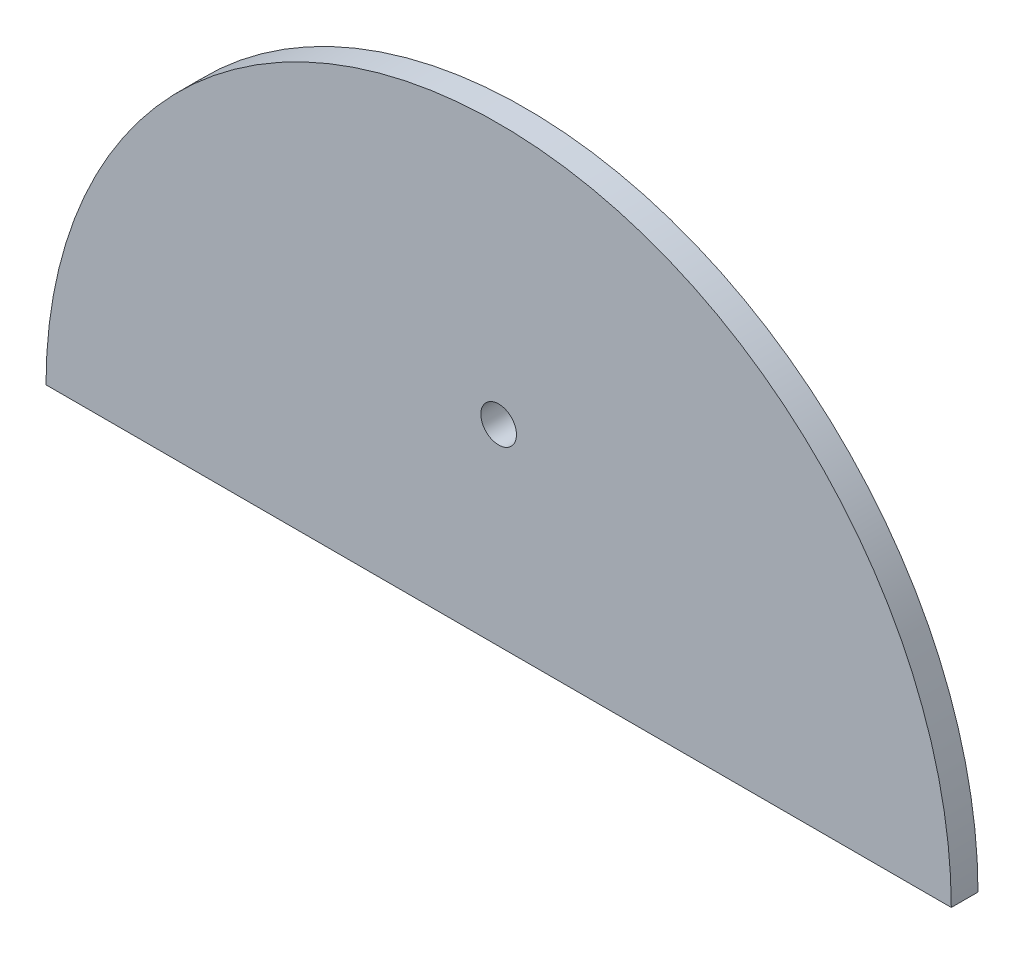
ISO-10303-21;
HEADER;
FILE_DESCRIPTION(('STEP AP214'),'2;1');
FILE_NAME('part.step','',(''),(''),'','','');
FILE_SCHEMA(('AUTOMOTIVE_DESIGN { 1 0 10303 214 1 1 1 1 }'));
ENDSEC;
DATA;
#1=APPLICATION_CONTEXT('core data for automotive mechanical design processes');
#2=APPLICATION_PROTOCOL_DEFINITION('international standard','automotive_design',2000,#1);
#3=PRODUCT_CONTEXT('',#1,'mechanical');
#4=PRODUCT('Part','Part','',(#3));
#5=PRODUCT_RELATED_PRODUCT_CATEGORY('part','',(#4));
#6=PRODUCT_DEFINITION_FORMATION('','',#4);
#7=PRODUCT_DEFINITION_CONTEXT('part definition',#1,'design');
#8=PRODUCT_DEFINITION('design','',#6,#7);
#9=PRODUCT_DEFINITION_SHAPE('','',#8);
#10=(LENGTH_UNIT() NAMED_UNIT(*) SI_UNIT(.MILLI.,.METRE.));
#11=(NAMED_UNIT(*) PLANE_ANGLE_UNIT() SI_UNIT($,.RADIAN.));
#12=(NAMED_UNIT(*) SI_UNIT($,.STERADIAN.) SOLID_ANGLE_UNIT());
#13=UNCERTAINTY_MEASURE_WITH_UNIT(LENGTH_MEASURE(1.E-05),#10,'distance_accuracy_value','');
#14=(GEOMETRIC_REPRESENTATION_CONTEXT(3) GLOBAL_UNCERTAINTY_ASSIGNED_CONTEXT((#13)) GLOBAL_UNIT_ASSIGNED_CONTEXT((#10,
#11,#12)) REPRESENTATION_CONTEXT('',''));
#15=CARTESIAN_POINT('',(0.,0.,0.));
#16=DIRECTION('',(0.,0.,1.));
#17=DIRECTION('',(1.,0.,0.));
#18=AXIS2_PLACEMENT_3D('',#15,#16,#17);
#19=CARTESIAN_POINT('',(0.,0.,3.));
#20=DIRECTION('',(0.,0.,-1.));
#21=DIRECTION('',(-1.,0.,0.));
#22=AXIS2_PLACEMENT_3D('',#19,#20,#21);
#23=CYLINDRICAL_SURFACE('',#22,50.85);
#24=CARTESIAN_POINT('',(0.,0.,0.));
#25=DIRECTION('',(0.,0.,1.));
#26=DIRECTION('',(-1.,0.,0.));
#27=AXIS2_PLACEMENT_3D('',#24,#25,#26);
#28=CIRCLE('',#27,50.85);
#29=CARTESIAN_POINT('',(50.85,0.,0.));
#30=VERTEX_POINT('',#29);
#31=CARTESIAN_POINT('',(-50.85,0.,0.));
#32=VERTEX_POINT('',#31);
#33=EDGE_CURVE('E63',#30,#32,#28,.T.);
#34=ORIENTED_EDGE('',*,*,#33,.T.);
#35=DIRECTION('',(0.,0.,-1.));
#36=VECTOR('',#35,1.);
#37=CARTESIAN_POINT('',(-50.85,0.,3.));
#38=LINE('',#37,#36);
#39=CARTESIAN_POINT('',(-50.85,0.,3.));
#40=VERTEX_POINT('',#39);
#41=EDGE_CURVE('E11',#40,#32,#38,.T.);
#42=ORIENTED_EDGE('',*,*,#41,.F.);
#43=CARTESIAN_POINT('',(0.,0.,3.));
#44=DIRECTION('',(0.,0.,1.));
#45=DIRECTION('',(-1.,0.,0.));
#46=AXIS2_PLACEMENT_3D('',#43,#44,#45);
#47=CIRCLE('',#46,50.85);
#48=CARTESIAN_POINT('',(50.85,0.,3.));
#49=VERTEX_POINT('',#48);
#50=EDGE_CURVE('E62',#49,#40,#47,.T.);
#51=ORIENTED_EDGE('',*,*,#50,.F.);
#52=DIRECTION('',(0.,0.,-1.));
#53=VECTOR('',#52,1.);
#54=CARTESIAN_POINT('',(50.85,0.,3.));
#55=LINE('',#54,#53);
#56=EDGE_CURVE('E40',#49,#30,#55,.T.);
#57=ORIENTED_EDGE('',*,*,#56,.T.);
#58=EDGE_LOOP('',(#34,#42,#51,#57));
#59=FACE_BOUND('',#58,.T.);
#60=ADVANCED_FACE('F32',(#59),#23,.T.);
#61=CARTESIAN_POINT('',(-50.85,0.,3.));
#62=DIRECTION('',(0.,1.,0.));
#63=DIRECTION('',(0.,0.,1.));
#64=AXIS2_PLACEMENT_3D('',#61,#62,#63);
#65=PLANE('',#64);
#66=DIRECTION('',(1.,0.,0.));
#67=VECTOR('',#66,1.);
#68=CARTESIAN_POINT('',(-50.85,0.,0.));
#69=LINE('',#68,#67);
#70=EDGE_CURVE('E55',#32,#30,#69,.T.);
#71=ORIENTED_EDGE('',*,*,#70,.T.);
#72=ORIENTED_EDGE('',*,*,#56,.F.);
#73=DIRECTION('',(1.,0.,0.));
#74=VECTOR('',#73,1.);
#75=CARTESIAN_POINT('',(-50.85,0.,3.));
#76=LINE('',#75,#74);
#77=EDGE_CURVE('E47',#40,#49,#76,.T.);
#78=ORIENTED_EDGE('',*,*,#77,.F.);
#79=ORIENTED_EDGE('',*,*,#41,.T.);
#80=EDGE_LOOP('',(#71,#72,#78,#79));
#81=FACE_BOUND('',#80,.T.);
#82=ADVANCED_FACE('F58',(#81),#65,.F.);
#83=CARTESIAN_POINT('',(0.,0.,3.));
#84=DIRECTION('',(0.,0.,-1.));
#85=DIRECTION('',(-1.,0.,0.));
#86=AXIS2_PLACEMENT_3D('',#83,#84,#85);
#87=PLANE('',#86);
#88=CARTESIAN_POINT('',(0.,21.5727272727273,3.));
#89=DIRECTION('',(0.,0.,1.));
#90=DIRECTION('',(1.,0.,0.));
#91=AXIS2_PLACEMENT_3D('',#88,#89,#90);
#92=CIRCLE('',#91,2.);
#93=CARTESIAN_POINT('',(2.,21.5727272727273,3.));
#94=VERTEX_POINT('',#93);
#95=EDGE_CURVE('E70',#94,#94,#92,.T.);
#96=ORIENTED_EDGE('',*,*,#95,.F.);
#97=EDGE_LOOP('',(#96));
#98=FACE_BOUND('',#97,.T.);
#99=ORIENTED_EDGE('',*,*,#50,.T.);
#100=ORIENTED_EDGE('',*,*,#77,.T.);
#101=EDGE_LOOP('',(#99,#100));
#102=FACE_BOUND('',#101,.T.);
#103=ADVANCED_FACE('F80',(#98,#102),#87,.F.);
#104=CARTESIAN_POINT('',(0.,0.,0.));
#105=DIRECTION('',(0.,0.,-1.));
#106=DIRECTION('',(-1.,0.,0.));
#107=AXIS2_PLACEMENT_3D('',#104,#105,#106);
#108=PLANE('',#107);
#109=CARTESIAN_POINT('',(0.,21.5727272727273,0.));
#110=DIRECTION('',(0.,0.,1.));
#111=DIRECTION('',(1.,0.,0.));
#112=AXIS2_PLACEMENT_3D('',#109,#110,#111);
#113=CIRCLE('',#112,2.);
#114=CARTESIAN_POINT('',(2.,21.5727272727273,0.));
#115=VERTEX_POINT('',#114);
#116=EDGE_CURVE('E67',#115,#115,#113,.T.);
#117=ORIENTED_EDGE('',*,*,#116,.T.);
#118=EDGE_LOOP('',(#117));
#119=FACE_BOUND('',#118,.T.);
#120=ORIENTED_EDGE('',*,*,#33,.F.);
#121=ORIENTED_EDGE('',*,*,#70,.F.);
#122=EDGE_LOOP('',(#120,#121));
#123=FACE_BOUND('',#122,.T.);
#124=ADVANCED_FACE('F66',(#119,#123),#108,.T.);
#125=CARTESIAN_POINT('',(0.,21.5727272727273,0.));
#126=DIRECTION('',(0.,0.,1.));
#127=DIRECTION('',(1.,0.,0.));
#128=AXIS2_PLACEMENT_3D('',#125,#126,#127);
#129=CYLINDRICAL_SURFACE('',#128,2.);
#130=ORIENTED_EDGE('',*,*,#116,.F.);
#131=EDGE_LOOP('',(#130));
#132=FACE_BOUND('',#131,.T.);
#133=ORIENTED_EDGE('',*,*,#95,.T.);
#134=EDGE_LOOP('',(#133));
#135=FACE_BOUND('',#134,.T.);
#136=ADVANCED_FACE('F78',(#132,#135),#129,.F.);
#137=CLOSED_SHELL('',(#60,#82,#103,#124,#136));
#138=MANIFOLD_SOLID_BREP('B2',#137);
#139=ADVANCED_BREP_SHAPE_REPRESENTATION('',(#18,#138),#14);
#140=SHAPE_DEFINITION_REPRESENTATION(#9,#139);
ENDSEC;
END-ISO-10303-21;
